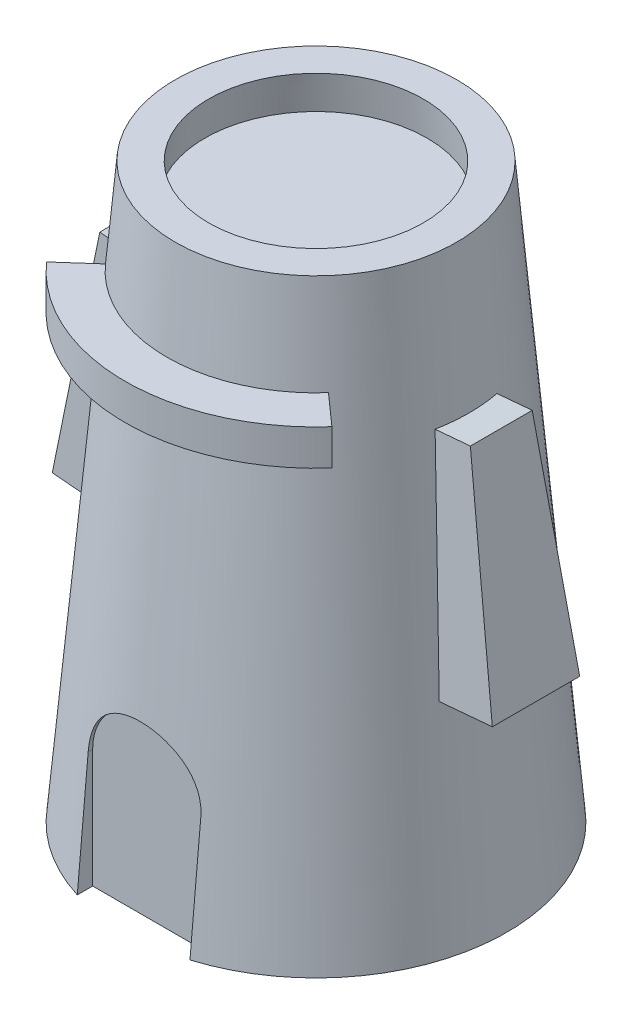
ISO-10303-21;
HEADER;
FILE_DESCRIPTION(('STEP AP214'),'2;1');
FILE_NAME('part.step','',(''),(''),'','','');
FILE_SCHEMA(('AUTOMOTIVE_DESIGN { 1 0 10303 214 1 1 1 1 }'));
ENDSEC;
DATA;
#1=APPLICATION_CONTEXT('core data for automotive mechanical design processes');
#2=APPLICATION_PROTOCOL_DEFINITION('international standard','automotive_design',2000,#1);
#3=PRODUCT_CONTEXT('',#1,'mechanical');
#4=PRODUCT('Part','Part','',(#3));
#5=PRODUCT_RELATED_PRODUCT_CATEGORY('part','',(#4));
#6=PRODUCT_DEFINITION_FORMATION('','',#4);
#7=PRODUCT_DEFINITION_CONTEXT('part definition',#1,'design');
#8=PRODUCT_DEFINITION('design','',#6,#7);
#9=PRODUCT_DEFINITION_SHAPE('','',#8);
#10=(LENGTH_UNIT() NAMED_UNIT(*) SI_UNIT(.MILLI.,.METRE.));
#11=(NAMED_UNIT(*) PLANE_ANGLE_UNIT() SI_UNIT($,.RADIAN.));
#12=(NAMED_UNIT(*) SI_UNIT($,.STERADIAN.) SOLID_ANGLE_UNIT());
#13=UNCERTAINTY_MEASURE_WITH_UNIT(LENGTH_MEASURE(1.E-05),#10,'distance_accuracy_value','');
#14=(GEOMETRIC_REPRESENTATION_CONTEXT(3) GLOBAL_UNCERTAINTY_ASSIGNED_CONTEXT((#13)) GLOBAL_UNIT_ASSIGNED_CONTEXT((#10,
#11,#12)) REPRESENTATION_CONTEXT('',''));
#15=CARTESIAN_POINT('',(0.,0.,0.));
#16=DIRECTION('',(0.,0.,1.));
#17=DIRECTION('',(1.,0.,0.));
#18=AXIS2_PLACEMENT_3D('',#15,#16,#17);
#19=CARTESIAN_POINT('',(11.8429543870565,36.041535535239,2.59239958701239));
#20=DIRECTION('',(-0.00501087536910878,0.0572745675515319,0.998345889479102));
#21=DIRECTION('',(0.,-0.998358423384695,0.0572752866149648));
#22=AXIS2_PLACEMENT_3D('',#19,#20,#21);
#23=PLANE('',#22);
#24=DIRECTION('',(0.996194698091746,0.0871557427476584,0.));
#25=VECTOR('',#24,1.);
#26=CARTESIAN_POINT('',(13.4618295782882,17.5377074278178,3.66207969084797));
#27=LINE('',#26,#25);
#28=CARTESIAN_POINT('',(13.9902531587515,17.5839385006481,3.66207969084797));
#29=VERTEX_POINT('',#28);
#30=CARTESIAN_POINT('',(18.4428030687469,17.9734861415561,3.66207969084797));
#31=VERTEX_POINT('',#30);
#32=EDGE_CURVE('E75',#29,#31,#27,.T.);
#33=ORIENTED_EDGE('',*,*,#32,.T.);
#34=DIRECTION('',(0.156176961155323,-0.986062525051787,0.057353757442587));
#35=VECTOR('',#34,1.);
#36=CARTESIAN_POINT('',(15.5300141692126,36.36411146792,2.59239958701239));
#37=LINE('',#36,#35);
#38=CARTESIAN_POINT('',(15.5300141692126,36.36411146792,2.59239958701239));
#39=VERTEX_POINT('',#38);
#40=EDGE_CURVE('E238',#39,#31,#37,.T.);
#41=ORIENTED_EDGE('',*,*,#40,.F.);
#42=DIRECTION('',(0.996194698091746,0.0871557427476584,0.));
#43=VECTOR('',#42,1.);
#44=CARTESIAN_POINT('',(11.8429543870565,36.041535535239,2.59239958701239));
#45=LINE('',#44,#43);
#46=CARTESIAN_POINT('',(12.5767559659794,36.1057348546721,2.59239958701239));
#47=VERTEX_POINT('',#46);
#48=EDGE_CURVE('E244',#47,#39,#45,.T.);
#49=ORIENTED_EDGE('',*,*,#48,.F.);
#50=CARTESIAN_POINT('',(13.9905140190561,17.5804751477517,3.66227969084797));
#51=CARTESIAN_POINT('',(13.8742056369155,19.1246516323009,3.57310734274572));
#52=CARTESIAN_POINT('',(13.7575556118968,20.6688023983537,3.48393475533349));
#53=CARTESIAN_POINT('',(13.5235134584469,23.757047236142,3.30558910828271));
#54=CARTESIAN_POINT('',(13.4061213302168,25.3011413078928,3.2164160486443));
#55=CARTESIAN_POINT('',(13.170536084674,28.3892684027383,3.03806941138959));
#56=CARTESIAN_POINT('',(13.0523429673271,29.9333014258304,2.94889583377327));
#57=CARTESIAN_POINT('',(12.815085945478,33.0213009514028,2.77054812415699));
#58=CARTESIAN_POINT('',(12.69602204074,34.565267453865,2.68137399215688));
#59=CARTESIAN_POINT('',(12.576487872776,36.1091975747719,2.59219958701239));
#60=B_SPLINE_CURVE_WITH_KNOTS('',3,(#50,#51,#52,#53,#54,#55,#56,#57,#58,#59),.UNSPECIFIED.,.F.,
.F.,(4,2,2,2,4),(0.,4.65334753552028,9.30669381041532,13.9600402851902,18.613388020996),.UNSPECIFIED.);
#61=EDGE_CURVE('E11',#29,#47,#60,.T.);
#62=ORIENTED_EDGE('',*,*,#61,.F.);
#63=EDGE_LOOP('',(#33,#41,#49,#62));
#64=FACE_BOUND('',#63,.T.);
#65=ADVANCED_FACE('F45',(#64),#23,.T.);
#66=CARTESIAN_POINT('',(11.8429543870565,36.041535535239,-2.59239958701239));
#67=DIRECTION('',(-0.0050108753691088,0.0572745675515319,-0.998345889479102));
#68=DIRECTION('',(0.,0.998358423384695,0.0572752866149648));
#69=AXIS2_PLACEMENT_3D('',#66,#67,#68);
#70=PLANE('',#69);
#71=DIRECTION('',(0.996194698091746,0.0871557427476584,0.));
#72=VECTOR('',#71,1.);
#73=CARTESIAN_POINT('',(11.8429543870565,36.041535535239,-2.59239958701239));
#74=LINE('',#73,#72);
#75=CARTESIAN_POINT('',(12.5767559659793,36.1057348546721,-2.59239958701239));
#76=VERTEX_POINT('',#75);
#77=CARTESIAN_POINT('',(15.5300141692126,36.36411146792,-2.59239958701239));
#78=VERTEX_POINT('',#77);
#79=EDGE_CURVE('E249',#76,#78,#74,.T.);
#80=ORIENTED_EDGE('',*,*,#79,.T.);
#81=DIRECTION('',(-0.156176961155323,0.986062525051787,0.057353757442587));
#82=VECTOR('',#81,1.);
#83=CARTESIAN_POINT('',(18.4428030687469,17.9734861415561,-3.66207969084798));
#84=LINE('',#83,#82);
#85=CARTESIAN_POINT('',(18.4428030687469,17.9734861415561,-3.66207969084798));
#86=VERTEX_POINT('',#85);
#87=EDGE_CURVE('E232',#86,#78,#84,.T.);
#88=ORIENTED_EDGE('',*,*,#87,.F.);
#89=DIRECTION('',(0.996194698091746,0.0871557427476584,0.));
#90=VECTOR('',#89,1.);
#91=CARTESIAN_POINT('',(13.4618295782882,17.5377074278178,-3.66207969084798));
#92=LINE('',#91,#90);
#93=CARTESIAN_POINT('',(13.9902531587515,17.5839385006481,-3.66207969084798));
#94=VERTEX_POINT('',#93);
#95=EDGE_CURVE('E253',#94,#86,#92,.T.);
#96=ORIENTED_EDGE('',*,*,#95,.F.);
#97=CARTESIAN_POINT('',(12.576487872776,36.1091975747719,-2.59219958701239));
#98=CARTESIAN_POINT('',(12.69602204074,34.565267453865,-2.68137399215688));
#99=CARTESIAN_POINT('',(12.815085945478,33.0213009514028,-2.77054812415699));
#100=CARTESIAN_POINT('',(13.0523429673271,29.9333014258304,-2.94889583377327));
#101=CARTESIAN_POINT('',(13.170536084674,28.3892684027383,-3.03806941138959));
#102=CARTESIAN_POINT('',(13.4061213302168,25.3011413078928,-3.2164160486443));
#103=CARTESIAN_POINT('',(13.5235134584469,23.757047236142,-3.30558910828271));
#104=CARTESIAN_POINT('',(13.7575556118968,20.6688023983537,-3.48393475533349));
#105=CARTESIAN_POINT('',(13.8742056369155,19.1246516323009,-3.57310734274572));
#106=CARTESIAN_POINT('',(13.9905140190561,17.5804751477517,-3.66227969084797));
#107=B_SPLINE_CURVE_WITH_KNOTS('',3,(#97,#98,#99,#100,#101,#102,#103,#104,#105,#106),
.UNSPECIFIED.,.F.,.F.,(4,2,2,2,4),(0.,4.6533477358058,9.30669421058067,13.9600404854757,
18.613388020996),.UNSPECIFIED.);
#108=EDGE_CURVE('E385',#76,#94,#107,.T.);
#109=ORIENTED_EDGE('',*,*,#108,.F.);
#110=EDGE_LOOP('',(#80,#88,#96,#109));
#111=FACE_BOUND('',#110,.T.);
#112=ADVANCED_FACE('F393',(#111),#70,.T.);
#113=CARTESIAN_POINT('',(11.8429543870565,36.041535535239,2.59239958701239));
#114=DIRECTION('',(-0.0871557427476584,0.996194698091746,0.));
#115=DIRECTION('',(-0.996194698091746,-0.0871557427476584,0.));
#116=AXIS2_PLACEMENT_3D('',#113,#114,#115);
#117=PLANE('',#116);
#118=ORIENTED_EDGE('',*,*,#48,.T.);
#119=DIRECTION('',(0.,0.,1.));
#120=VECTOR('',#119,1.);
#121=CARTESIAN_POINT('',(15.5300141692126,36.36411146792,-2.59239958701239));
#122=LINE('',#121,#120);
#123=EDGE_CURVE('E235',#78,#39,#122,.T.);
#124=ORIENTED_EDGE('',*,*,#123,.F.);
#125=ORIENTED_EDGE('',*,*,#79,.F.);
#126=CARTESIAN_POINT('',(-0.0990322849399,34.9967470814616,0.));
#127=DIRECTION('',(-0.0871557427476584,0.996194698091746,0.));
#128=DIRECTION('',(-0.996194698091746,-0.0871557427476584,0.));
#129=AXIS2_PLACEMENT_3D('',#126,#127,#128);
#130=ELLIPSE('',#129,12.9876031210282,12.9378023547987);
#131=EDGE_CURVE('E60',#47,#76,#130,.T.);
#132=ORIENTED_EDGE('',*,*,#131,.F.);
#133=EDGE_LOOP('',(#118,#124,#125,#132));
#134=FACE_BOUND('',#133,.T.);
#135=ADVANCED_FACE('F397',(#134),#117,.T.);
#136=CARTESIAN_POINT('',(0.,0.,0.));
#137=DIRECTION('',(0.,-1.,0.));
#138=DIRECTION('',(0.,0.,1.));
#139=AXIS2_PLACEMENT_3D('',#136,#137,#138);
#140=CONICAL_SURFACE('',#139,16.,0.0872664625997167);
#141=CARTESIAN_POINT('',(-12.576487872776,36.1091975747719,-2.59219958701239));
#142=CARTESIAN_POINT('',(-12.69602204074,34.565267453865,-2.68137399215688));
#143=CARTESIAN_POINT('',(-12.815085945478,33.0213009514028,-2.77054812415699));
#144=CARTESIAN_POINT('',(-13.0523429673271,29.9333014258304,-2.94889583377327));
#145=CARTESIAN_POINT('',(-13.170536084674,28.3892684027383,-3.03806941138959));
#146=CARTESIAN_POINT('',(-13.4061213302168,25.3011413078928,-3.2164160486443));
#147=CARTESIAN_POINT('',(-13.5235134584469,23.757047236142,-3.30558910828271));
#148=CARTESIAN_POINT('',(-13.7575556118968,20.6688023983537,-3.48393475533349));
#149=CARTESIAN_POINT('',(-13.8742056369155,19.1246516323009,-3.57310734274572));
#150=CARTESIAN_POINT('',(-13.9905140190561,17.5804751477517,-3.66227969084797));
#151=B_SPLINE_CURVE_WITH_KNOTS('',3,(#141,#142,#143,#144,#145,#146,#147,#148,#149,#150),
.UNSPECIFIED.,.F.,.F.,(4,2,2,2,4),(0.,4.6533477358058,9.30669421058067,13.9600404854757,
18.613388020996),.UNSPECIFIED.);
#152=CARTESIAN_POINT('',(-12.5767559659793,36.1057348546721,-2.59239958701239));
#153=VERTEX_POINT('',#152);
#154=CARTESIAN_POINT('',(-13.9902531587515,17.5839385006481,-3.66207969084797));
#155=VERTEX_POINT('',#154);
#156=EDGE_CURVE('E67',#153,#155,#151,.T.);
#157=ORIENTED_EDGE('',*,*,#156,.F.);
#158=CARTESIAN_POINT('',(0.0990322849399,34.9967470814616,0.));
#159=DIRECTION('',(-0.0871557427476584,-0.996194698091746,0.));
#160=DIRECTION('',(0.996194698091746,-0.0871557427476584,0.));
#161=AXIS2_PLACEMENT_3D('',#158,#159,#160);
#162=ELLIPSE('',#161,12.9876031210282,12.9378023547987);
#163=CARTESIAN_POINT('',(-12.5767559659794,36.1057348546721,2.59239958701239));
#164=VERTEX_POINT('',#163);
#165=EDGE_CURVE('E186',#164,#153,#162,.T.);
#166=ORIENTED_EDGE('',*,*,#165,.F.);
#167=CARTESIAN_POINT('',(-13.9905140190561,17.5804751477517,3.66227969084797));
#168=CARTESIAN_POINT('',(-13.8742056369155,19.1246516323009,3.57310734274572));
#169=CARTESIAN_POINT('',(-13.7575556118968,20.6688023983537,3.48393475533349));
#170=CARTESIAN_POINT('',(-13.5235134584469,23.757047236142,3.30558910828271));
#171=CARTESIAN_POINT('',(-13.4061213302168,25.3011413078928,3.2164160486443));
#172=CARTESIAN_POINT('',(-13.170536084674,28.3892684027383,3.03806941138959));
#173=CARTESIAN_POINT('',(-13.0523429673271,29.9333014258304,2.94889583377327));
#174=CARTESIAN_POINT('',(-12.815085945478,33.0213009514028,2.77054812415699));
#175=CARTESIAN_POINT('',(-12.69602204074,34.565267453865,2.68137399215688));
#176=CARTESIAN_POINT('',(-12.576487872776,36.1091975747719,2.59219958701239));
#177=B_SPLINE_CURVE_WITH_KNOTS('',3,(#167,#168,#169,#170,#171,#172,#173,#174,#175,#176),
.UNSPECIFIED.,.F.,.F.,(4,2,2,2,4),(0.,4.65334753552028,9.30669381041532,13.9600402851902,
18.613388020996),.UNSPECIFIED.);
#178=CARTESIAN_POINT('',(-13.9902531587515,17.5839385006481,3.66207969084797));
#179=VERTEX_POINT('',#178);
#180=EDGE_CURVE('E224',#179,#164,#177,.T.);
#181=ORIENTED_EDGE('',*,*,#180,.F.);
#182=CARTESIAN_POINT('',(0.111519164573197,16.3501932867336,0.));
#183=DIRECTION('',(0.0871557427476584,0.996194698091746,0.));
#184=DIRECTION('',(0.996194698091746,-0.0871557427476584,0.));
#185=AXIS2_PLACEMENT_3D('',#182,#183,#184);
#186=ELLIPSE('',#185,14.6251967299783,14.5691166360131);
#187=EDGE_CURVE('E192',#155,#179,#186,.T.);
#188=ORIENTED_EDGE('',*,*,#187,.F.);
#189=EDGE_LOOP('',(#157,#166,#181,#188));
#190=FACE_BOUND('',#189,.T.);
#191=CARTESIAN_POINT('',(-0.111519164573197,16.3501932867336,0.));
#192=DIRECTION('',(0.0871557427476584,-0.996194698091746,0.));
#193=DIRECTION('',(-0.996194698091746,-0.0871557427476584,0.));
#194=AXIS2_PLACEMENT_3D('',#191,#192,#193);
#195=ELLIPSE('',#194,14.6251967299783,14.5691166360131);
#196=EDGE_CURVE('E381',#94,#29,#195,.T.);
#197=ORIENTED_EDGE('',*,*,#196,.T.);
#198=ORIENTED_EDGE('',*,*,#61,.T.);
#199=ORIENTED_EDGE('',*,*,#131,.T.);
#200=ORIENTED_EDGE('',*,*,#108,.T.);
#201=EDGE_LOOP('',(#197,#198,#199,#200));
#202=FACE_BOUND('',#201,.T.);
#203=CARTESIAN_POINT('',(0.,37.,0.));
#204=DIRECTION('',(0.,1.,0.));
#205=DIRECTION('',(0.,0.,1.));
#206=AXIS2_PLACEMENT_3D('',#203,#204,#205);
#207=CIRCLE('',#206,12.7629194495408);
#208=CARTESIAN_POINT('',(-9.54144119850317,37.,8.47661564133785));
#209=VERTEX_POINT('',#208);
#210=CARTESIAN_POINT('',(9.54144119850317,37.,8.47661564133785));
#211=VERTEX_POINT('',#210);
#212=EDGE_CURVE('E374',#209,#211,#207,.T.);
#213=ORIENTED_EDGE('',*,*,#212,.F.);
#214=DIRECTION('',(0.0651568316972,0.996194698091746,-0.0578853243670514));
#215=VECTOR('',#214,1.);
#216=CARTESIAN_POINT('',(0.,182.880836844181,0.));
#217=LINE('',#216,#215);
#218=CARTESIAN_POINT('',(-9.3452240378758,40.,8.30229633063101));
#219=VERTEX_POINT('',#218);
#220=EDGE_CURVE('E377',#209,#219,#217,.T.);
#221=ORIENTED_EDGE('',*,*,#220,.T.);
#222=CARTESIAN_POINT('',(0.,40.,0.));
#223=DIRECTION('',(0.,-1.,0.));
#224=DIRECTION('',(0.,0.,1.));
#225=AXIS2_PLACEMENT_3D('',#222,#223,#224);
#226=CIRCLE('',#225,12.500453458963);
#227=CARTESIAN_POINT('',(9.3452240378758,40.,8.30229633063101));
#228=VERTEX_POINT('',#227);
#229=EDGE_CURVE('E278',#228,#219,#226,.T.);
#230=ORIENTED_EDGE('',*,*,#229,.F.);
#231=DIRECTION('',(0.0651568316971999,-0.996194698091745,0.0578853243670515));
#232=VECTOR('',#231,1.);
#233=CARTESIAN_POINT('',(0.,182.880836844181,0.));
#234=LINE('',#233,#232);
#235=EDGE_CURVE('E368',#228,#211,#234,.T.);
#236=ORIENTED_EDGE('',*,*,#235,.T.);
#237=EDGE_LOOP('',(#213,#221,#230,#236));
#238=FACE_BOUND('',#237,.T.);
#239=CARTESIAN_POINT('',(0.,48.,0.));
#240=DIRECTION('',(0.,1.,0.));
#241=DIRECTION('',(0.,0.,1.));
#242=AXIS2_PLACEMENT_3D('',#239,#240,#241);
#243=CIRCLE('',#242,11.8005441507556);
#244=CARTESIAN_POINT('',(0.,48.,11.8005441507556));
#245=VERTEX_POINT('',#244);
#246=EDGE_CURVE('E369',#245,#245,#243,.T.);
#247=ORIENTED_EDGE('',*,*,#246,.F.);
#248=EDGE_LOOP('',(#247));
#249=FACE_BOUND('',#248,.T.);
#250=CARTESIAN_POINT('',(-4.72137497250259,9.93191785659461,14.3756005464363));
#251=CARTESIAN_POINT('',(-4.72139788835783,10.0590150872273,14.3638758051247));
#252=CARTESIAN_POINT('',(-4.71625427873994,10.1862710893364,14.3538579667337));
#253=CARTESIAN_POINT('',(-4.69568402436785,10.4401614953945,14.3372358710072));
#254=CARTESIAN_POINT('',(-4.68025833059139,10.5667959557383,14.3306312980833));
#255=CARTESIAN_POINT('',(-4.63921932100184,10.8182497434939,14.3208441702329));
#256=CARTESIAN_POINT('',(-4.61362860166552,10.9430724646487,14.3176540827566));
#257=CARTESIAN_POINT('',(-4.55243134515556,11.1902757920821,14.3145369678067));
#258=CARTESIAN_POINT('',(-4.51682495561441,11.3126564343289,14.3146098922384));
#259=CARTESIAN_POINT('',(-4.43584755746242,11.5541084723224,14.317796453754));
#260=CARTESIAN_POINT('',(-4.39047600691323,11.673179683991,14.3209102596321));
#261=CARTESIAN_POINT('',(-4.29028718329289,11.907220331802,14.329870893753));
#262=CARTESIAN_POINT('',(-4.23546637777038,12.0221882145099,14.3357187454798));
#263=CARTESIAN_POINT('',(-4.11679138643067,12.2471941395018,14.3497696153254));
#264=CARTESIAN_POINT('',(-4.05293872141406,12.3572330076432,14.3579722371826));
#265=CARTESIAN_POINT('',(-3.91664744833961,12.5717063480938,14.3763014076876));
#266=CARTESIAN_POINT('',(-3.84420558044353,12.6761386705787,14.3864286876807));
#267=CARTESIAN_POINT('',(-3.61203033561829,12.9835416259394,14.4193855178464));
#268=CARTESIAN_POINT('',(-3.43945884255084,13.176803447879,14.4445255741758));
#269=CARTESIAN_POINT('',(-3.0653099344814,13.5323946398322,14.4967297965062));
#270=CARTESIAN_POINT('',(-2.86372441952788,13.6947153423873,14.5237944987466));
#271=CARTESIAN_POINT('',(-2.42977315730511,13.9890134769174,14.5766569022345));
#272=CARTESIAN_POINT('',(-2.19663639456861,14.1198707500282,14.6023875973823));
#273=CARTESIAN_POINT('',(-1.71116345935544,14.3405633663105,14.6477619018518));
#274=CARTESIAN_POINT('',(-1.45883003561549,14.4304045696527,14.6674063806127));
#275=CARTESIAN_POINT('',(-0.944326325035236,14.5656640291313,14.6975964542417));
#276=CARTESIAN_POINT('',(-0.682260423170302,14.6114610762363,14.7082195409522));
#277=CARTESIAN_POINT('',(-0.153956869099089,14.6584254559354,14.7191184843299));
#278=CARTESIAN_POINT('',(0.112280275684338,14.6595981754557,14.7193955899355));
#279=CARTESIAN_POINT('',(0.635021993287651,14.6177719919119,14.7096802602249));
#280=CARTESIAN_POINT('',(0.891610941764581,14.5757628831868,14.6999179417548));
#281=CARTESIAN_POINT('',(1.39399656187394,14.4504335930244,14.6718241006602));
#282=CARTESIAN_POINT('',(1.63979277381855,14.3671116538316,14.6534922134243));
#283=CARTESIAN_POINT('',(2.11564371527183,14.1609700592217,14.6106424372933));
#284=CARTESIAN_POINT('',(2.34557560942395,14.0378768022659,14.586081958983));
#285=CARTESIAN_POINT('',(2.78200344961043,13.7556375445066,14.5343091977987));
#286=CARTESIAN_POINT('',(2.98849490758702,13.5964846569101,14.5070964089437));
#287=CARTESIAN_POINT('',(3.27874896293216,13.3319633687636,14.4670481199013));
#288=CARTESIAN_POINT('',(3.37326355787484,13.2382043026011,14.4536716514318));
#289=CARTESIAN_POINT('',(3.55409177401787,13.042983553911,14.427861758656));
#290=CARTESIAN_POINT('',(3.64040841532043,12.9415247329262,14.4154279874058));
#291=CARTESIAN_POINT('',(3.80426951625068,12.7315230094764,14.3920588502497));
#292=CARTESIAN_POINT('',(3.88180981062927,12.6229767815481,14.3811241953077));
#293=CARTESIAN_POINT('',(4.0274770785046,12.3996218110075,14.3613070282121));
#294=CARTESIAN_POINT('',(4.0956079126914,12.2848156639624,14.3524236734013));
#295=CARTESIAN_POINT('',(4.22153854623757,12.0505051825112,14.3372582831934));
#296=CARTESIAN_POINT('',(4.27940491493546,11.931037751277,14.330959109704));
#297=CARTESIAN_POINT('',(4.38488884071248,11.6876007644461,14.3213118421639));
#298=CARTESIAN_POINT('',(4.43251064532901,11.5636330997217,14.3179625232736));
#299=CARTESIAN_POINT('',(4.51712081282112,11.312184167939,14.3145647465853));
#300=CARTESIAN_POINT('',(4.55411756754405,11.1847057614257,14.314513676596));
#301=CARTESIAN_POINT('',(4.61722858120083,10.9271812827916,14.3179561466824));
#302=CARTESIAN_POINT('',(4.64334733622303,10.7971362948134,14.3214482202534));
#303=CARTESIAN_POINT('',(4.68309663257963,10.5446164119529,14.3317436087191));
#304=CARTESIAN_POINT('',(4.69747269290635,10.4222480201326,14.3382983155178));
#305=CARTESIAN_POINT('',(4.71661371475432,10.1771772705615,14.3545775346267));
#306=CARTESIAN_POINT('',(4.72139462459299,10.0544758069876,14.3642967558148));
#307=CARTESIAN_POINT('',(4.72137497250259,9.93191785659461,14.3756005464363));
#308=B_SPLINE_CURVE_WITH_KNOTS('',3,(#250,#251,#252,#253,#254,#255,#256,#257,#258,#259,#260,
#261,#262,#263,#264,#265,#266,#267,#268,#269,#270,#271,#272,#273,#274,#275,#276,#277,#278,#279,
#280,#281,#282,#283,#284,#285,#286,#287,#288,#289,#290,#291,#292,#293,#294,#295,#296,#297,#298,
#299,#300,#301,#302,#303,#304,#305,#306,#307),.UNSPECIFIED.,.F.,.F.,(4,2,2,2,2,2,2,2,2,2,2,2,2,
2,2,2,2,2,2,2,2,2,2,2,2,2,2,2,4),(0.,0.382797036526025,0.765558673520905,1.14747416502821,
1.52938402733779,1.91131509001384,2.29338924234638,2.67539913676789,3.05755448133077,
3.83467280582132,4.61200850363488,5.41389316221393,6.21566321564603,7.01047449163439,
7.80518981988569,8.58208662110998,9.35901648014699,10.1414091785669,10.9239514271924,
11.3249611626804,11.7258225896185,12.126873474404,12.5277593165161,12.9259417747002,
13.3239588213995,13.7216606373559,14.119197911913,14.4889379122243,14.8580628486362),.UNSPECIFIED.);
#309=CARTESIAN_POINT('',(-4.72137497673865,9.93211785659461,14.3755821277671));
#310=VERTEX_POINT('',#309);
#311=CARTESIAN_POINT('',(4.72137497673865,9.93211785659462,14.3755821277671));
#312=VERTEX_POINT('',#311);
#313=EDGE_CURVE('E359',#310,#312,#308,.T.);
#314=ORIENTED_EDGE('',*,*,#313,.T.);
#315=CARTESIAN_POINT('',(4.72137497673865,20.0638017122441,13.4394391211516));
#316=CARTESIAN_POINT('',(4.72137497673865,15.7148954767797,13.8426666135956));
#317=CARTESIAN_POINT('',(4.72137497673865,11.3658154713658,14.2440142550417));
#318=CARTESIAN_POINT('',(4.72137497673865,2.66737341078984,15.0436308338049));
#319=CARTESIAN_POINT('',(4.72137497673865,-1.6819886443048,15.4418997718559));
#320=CARTESIAN_POINT('',(4.72137497673865,-7.39819083521981,15.9637409895659));
#321=CARTESIAN_POINT('',(4.72137497673865,-8.76493244842721,16.0883936612874));
#322=CARTESIAN_POINT('',(4.72137497673865,-10.1316838556495,16.2129385338625));
#323=B_SPLINE_CURVE_WITH_KNOTS('',3,(#315,#316,#317,#318,#319,#320,#321,#322),.UNSPECIFIED.,.F.,
.F.,(4,2,2,4),(0.,13.1026779953092,26.2053528671949,30.322595638231),.UNSPECIFIED.);
#324=CARTESIAN_POINT('',(4.72137497673865,0.,15.2875314661663));
#325=VERTEX_POINT('',#324);
#326=EDGE_CURVE('E335',#312,#325,#323,.T.);
#327=ORIENTED_EDGE('',*,*,#326,.T.);
#328=CARTESIAN_POINT('',(0.,0.,0.));
#329=DIRECTION('',(0.,1.,0.));
#330=DIRECTION('',(0.,0.,1.));
#331=AXIS2_PLACEMENT_3D('',#328,#329,#330);
#332=CIRCLE('',#331,16.);
#333=CARTESIAN_POINT('',(-4.72137497673865,0.,15.2875314661663));
#334=VERTEX_POINT('',#333);
#335=EDGE_CURVE('E459',#325,#334,#332,.T.);
#336=ORIENTED_EDGE('',*,*,#335,.T.);
#337=CARTESIAN_POINT('',(-4.72137497673865,-10.1316838556495,16.2129385338625));
#338=CARTESIAN_POINT('',(-4.72137497673865,-7.61522695712537,15.9836285112462));
#339=CARTESIAN_POINT('',(-4.72137497673865,-5.09880379887518,15.7539477970251));
#340=CARTESIAN_POINT('',(-4.72137497673865,-0.0660366125740351,15.2937254544311));
#341=CARTESIAN_POINT('',(-4.72137497673865,2.45030741548923,15.0631838261929));
#342=CARTESIAN_POINT('',(-4.72137497673865,7.48290557305144,14.6011200443265));
#343=CARTESIAN_POINT('',(-4.72137497673865,9.99915970254703,14.3695978906617));
#344=CARTESIAN_POINT('',(-4.72137497673865,15.0315631839285,13.9054134710712));
#345=CARTESIAN_POINT('',(-4.72137497673865,17.5477125357978,13.6727512049669));
#346=CARTESIAN_POINT('',(-4.72137497673865,20.0638017122441,13.4394391211516));
#347=B_SPLINE_CURVE_WITH_KNOTS('',3,(#337,#338,#339,#340,#341,#342,#343,#344,#345,#346),
.UNSPECIFIED.,.F.,.F.,(4,2,2,2,4),(0.,7.58064945053332,15.1612977154162,22.7419462638079,
30.3225959996163),.UNSPECIFIED.);
#348=EDGE_CURVE('E316',#334,#310,#347,.T.);
#349=ORIENTED_EDGE('',*,*,#348,.T.);
#350=EDGE_LOOP('',(#314,#327,#336,#349));
#351=FACE_BOUND('',#350,.T.);
#352=ADVANCED_FACE('F47',(#190,#202,#238,#249,#351),#140,.T.);
#353=CARTESIAN_POINT('',(0.,48.,0.));
#354=DIRECTION('',(0.,1.,0.));
#355=DIRECTION('',(0.,0.,1.));
#356=AXIS2_PLACEMENT_3D('',#353,#354,#355);
#357=PLANE('',#356);
#358=CARTESIAN_POINT('',(0.,48.,0.));
#359=DIRECTION('',(0.,1.,0.));
#360=DIRECTION('',(0.,0.,1.));
#361=AXIS2_PLACEMENT_3D('',#358,#359,#360);
#362=CIRCLE('',#361,9.);
#363=CARTESIAN_POINT('',(0.,48.,9.));
#364=VERTEX_POINT('',#363);
#365=EDGE_CURVE('E451',#364,#364,#362,.T.);
#366=ORIENTED_EDGE('',*,*,#365,.F.);
#367=EDGE_LOOP('',(#366));
#368=FACE_BOUND('',#367,.T.);
#369=ORIENTED_EDGE('',*,*,#246,.T.);
#370=EDGE_LOOP('',(#369));
#371=FACE_BOUND('',#370,.T.);
#372=ADVANCED_FACE('F466',(#368,#371),#357,.T.);
#373=CARTESIAN_POINT('',(0.,0.,0.));
#374=DIRECTION('',(0.,1.,0.));
#375=DIRECTION('',(0.,0.,1.));
#376=AXIS2_PLACEMENT_3D('',#373,#374,#375);
#377=PLANE('',#376);
#378=CARTESIAN_POINT('',(0.,0.,0.));
#379=DIRECTION('',(0.,1.,0.));
#380=DIRECTION('',(0.,0.,1.));
#381=AXIS2_PLACEMENT_3D('',#378,#379,#380);
#382=CIRCLE('',#381,12.5);
#383=CARTESIAN_POINT('',(0.,0.,12.5));
#384=VERTEX_POINT('',#383);
#385=EDGE_CURVE('E287',#384,#384,#382,.T.);
#386=ORIENTED_EDGE('',*,*,#385,.T.);
#387=EDGE_LOOP('',(#386));
#388=FACE_BOUND('',#387,.T.);
#389=ORIENTED_EDGE('',*,*,#335,.F.);
#390=DIRECTION('',(0.,0.,1.));
#391=VECTOR('',#390,1.);
#392=CARTESIAN_POINT('',(4.72137497673865,0.,14.));
#393=LINE('',#392,#391);
#394=CARTESIAN_POINT('',(4.72137497673865,0.,14.));
#395=VERTEX_POINT('',#394);
#396=EDGE_CURVE('E317',#395,#325,#393,.T.);
#397=ORIENTED_EDGE('',*,*,#396,.F.);
#398=DIRECTION('',(1.,0.,0.));
#399=VECTOR('',#398,1.);
#400=CARTESIAN_POINT('',(-4.72137497673865,0.,14.));
#401=LINE('',#400,#399);
#402=CARTESIAN_POINT('',(-4.72137497673865,0.,14.));
#403=VERTEX_POINT('',#402);
#404=EDGE_CURVE('E304',#403,#395,#401,.T.);
#405=ORIENTED_EDGE('',*,*,#404,.F.);
#406=DIRECTION('',(0.,0.,1.));
#407=VECTOR('',#406,1.);
#408=CARTESIAN_POINT('',(-4.72137497673865,0.,14.));
#409=LINE('',#408,#407);
#410=EDGE_CURVE('E320',#403,#334,#409,.T.);
#411=ORIENTED_EDGE('',*,*,#410,.T.);
#412=EDGE_LOOP('',(#389,#397,#405,#411));
#413=FACE_BOUND('',#412,.T.);
#414=ADVANCED_FACE('F446',(#388,#413),#377,.F.);
#415=CARTESIAN_POINT('',(0.,48.,0.));
#416=DIRECTION('',(0.,-1.,0.));
#417=DIRECTION('',(0.,0.,1.));
#418=AXIS2_PLACEMENT_3D('',#415,#416,#417);
#419=CONICAL_SURFACE('',#418,9.,0.10471975511966);
#420=CARTESIAN_POINT('',(0.,45.,0.));
#421=DIRECTION('',(0.,1.,0.));
#422=DIRECTION('',(0.,0.,1.));
#423=AXIS2_PLACEMENT_3D('',#420,#421,#422);
#424=CIRCLE('',#423,9.31531270579703);
#425=CARTESIAN_POINT('',(0.,45.,9.31531270579703));
#426=VERTEX_POINT('',#425);
#427=EDGE_CURVE('E454',#426,#426,#424,.T.);
#428=ORIENTED_EDGE('',*,*,#427,.F.);
#429=EDGE_LOOP('',(#428));
#430=FACE_BOUND('',#429,.T.);
#431=ORIENTED_EDGE('',*,*,#365,.T.);
#432=EDGE_LOOP('',(#431));
#433=FACE_BOUND('',#432,.T.);
#434=ADVANCED_FACE('F542',(#430,#433),#419,.F.);
#435=CARTESIAN_POINT('',(0.,45.,0.));
#436=DIRECTION('',(0.,1.,0.));
#437=DIRECTION('',(0.,0.,1.));
#438=AXIS2_PLACEMENT_3D('',#435,#436,#437);
#439=PLANE('',#438);
#440=ORIENTED_EDGE('',*,*,#427,.T.);
#441=EDGE_LOOP('',(#440));
#442=FACE_BOUND('',#441,.T.);
#443=ADVANCED_FACE('F355',(#442),#439,.T.);
#444=CARTESIAN_POINT('',(0.,9.93211785659462,14.));
#445=DIRECTION('',(0.,0.,1.));
#446=DIRECTION('',(1.,0.,0.));
#447=AXIS2_PLACEMENT_3D('',#444,#445,#446);
#448=CYLINDRICAL_SURFACE('',#447,4.72137497673865);
#449=DIRECTION('',(0.,0.,1.));
#450=VECTOR('',#449,1.);
#451=CARTESIAN_POINT('',(-4.72137497673865,9.93211785659461,14.));
#452=LINE('',#451,#450);
#453=CARTESIAN_POINT('',(-4.72137497673865,9.93211785659461,14.));
#454=VERTEX_POINT('',#453);
#455=EDGE_CURVE('E311',#454,#310,#452,.T.);
#456=ORIENTED_EDGE('',*,*,#455,.F.);
#457=CARTESIAN_POINT('',(0.,9.93211785659462,14.));
#458=DIRECTION('',(0.,0.,1.));
#459=DIRECTION('',(1.,0.,0.));
#460=AXIS2_PLACEMENT_3D('',#457,#458,#459);
#461=CIRCLE('',#460,4.72137497673865);
#462=CARTESIAN_POINT('',(4.72137497673865,9.93211785659462,14.));
#463=VERTEX_POINT('',#462);
#464=EDGE_CURVE('E297',#463,#454,#461,.T.);
#465=ORIENTED_EDGE('',*,*,#464,.F.);
#466=DIRECTION('',(0.,0.,1.));
#467=VECTOR('',#466,1.);
#468=CARTESIAN_POINT('',(4.72137497673865,9.93211785659462,14.));
#469=LINE('',#468,#467);
#470=EDGE_CURVE('E312',#463,#312,#469,.T.);
#471=ORIENTED_EDGE('',*,*,#470,.T.);
#472=ORIENTED_EDGE('',*,*,#313,.F.);
#473=EDGE_LOOP('',(#456,#465,#471,#472));
#474=FACE_BOUND('',#473,.T.);
#475=ADVANCED_FACE('F351',(#474),#448,.F.);
#476=CARTESIAN_POINT('',(4.72137497673865,0.,14.));
#477=DIRECTION('',(1.,0.,0.));
#478=DIRECTION('',(0.,0.,-1.));
#479=AXIS2_PLACEMENT_3D('',#476,#477,#478);
#480=PLANE('',#479);
#481=ORIENTED_EDGE('',*,*,#470,.F.);
#482=DIRECTION('',(0.,1.,0.));
#483=VECTOR('',#482,1.);
#484=CARTESIAN_POINT('',(4.72137497673865,0.,14.));
#485=LINE('',#484,#483);
#486=EDGE_CURVE('E307',#395,#463,#485,.T.);
#487=ORIENTED_EDGE('',*,*,#486,.F.);
#488=ORIENTED_EDGE('',*,*,#396,.T.);
#489=ORIENTED_EDGE('',*,*,#326,.F.);
#490=EDGE_LOOP('',(#481,#487,#488,#489));
#491=FACE_BOUND('',#490,.T.);
#492=ADVANCED_FACE('F347',(#491),#480,.F.);
#493=CARTESIAN_POINT('',(-4.72137497673865,0.,14.));
#494=DIRECTION('',(-1.,0.,0.));
#495=DIRECTION('',(0.,0.,1.));
#496=AXIS2_PLACEMENT_3D('',#493,#494,#495);
#497=PLANE('',#496);
#498=ORIENTED_EDGE('',*,*,#410,.F.);
#499=DIRECTION('',(0.,-1.,0.));
#500=VECTOR('',#499,1.);
#501=CARTESIAN_POINT('',(-4.72137497673865,0.,14.));
#502=LINE('',#501,#500);
#503=EDGE_CURVE('E301',#454,#403,#502,.T.);
#504=ORIENTED_EDGE('',*,*,#503,.F.);
#505=ORIENTED_EDGE('',*,*,#455,.T.);
#506=ORIENTED_EDGE('',*,*,#348,.F.);
#507=EDGE_LOOP('',(#498,#504,#505,#506));
#508=FACE_BOUND('',#507,.T.);
#509=ADVANCED_FACE('F342',(#508),#497,.F.);
#510=CARTESIAN_POINT('',(0.,9.93211785659462,14.));
#511=DIRECTION('',(0.,0.,1.));
#512=DIRECTION('',(1.,0.,0.));
#513=AXIS2_PLACEMENT_3D('',#510,#511,#512);
#514=PLANE('',#513);
#515=ORIENTED_EDGE('',*,*,#464,.T.);
#516=ORIENTED_EDGE('',*,*,#503,.T.);
#517=ORIENTED_EDGE('',*,*,#404,.T.);
#518=ORIENTED_EDGE('',*,*,#486,.T.);
#519=EDGE_LOOP('',(#515,#516,#517,#518));
#520=FACE_BOUND('',#519,.T.);
#521=ADVANCED_FACE('F346',(#520),#514,.T.);
#522=CARTESIAN_POINT('',(0.,0.,0.));
#523=DIRECTION('',(0.,-1.,0.));
#524=DIRECTION('',(0.,0.,1.));
#525=AXIS2_PLACEMENT_3D('',#522,#523,#524);
#526=CONICAL_SURFACE('',#525,12.5,0.0872664625997167);
#527=CARTESIAN_POINT('',(0.,43.,0.));
#528=DIRECTION('',(0.,1.,0.));
#529=DIRECTION('',(0.,0.,1.));
#530=AXIS2_PLACEMENT_3D('',#527,#528,#529);
#531=CIRCLE('',#530,8.73798746838526);
#532=CARTESIAN_POINT('',(0.,43.,8.73798746838527));
#533=VERTEX_POINT('',#532);
#534=EDGE_CURVE('E293',#533,#533,#531,.T.);
#535=ORIENTED_EDGE('',*,*,#534,.T.);
#536=EDGE_LOOP('',(#535));
#537=FACE_BOUND('',#536,.T.);
#538=ORIENTED_EDGE('',*,*,#385,.F.);
#539=EDGE_LOOP('',(#538));
#540=FACE_BOUND('',#539,.T.);
#541=ADVANCED_FACE('F428',(#537,#540),#526,.F.);
#542=CARTESIAN_POINT('',(0.,43.,0.));
#543=DIRECTION('',(0.,1.,0.));
#544=DIRECTION('',(0.,0.,1.));
#545=AXIS2_PLACEMENT_3D('',#542,#543,#544);
#546=PLANE('',#545);
#547=ORIENTED_EDGE('',*,*,#534,.F.);
#548=EDGE_LOOP('',(#547));
#549=FACE_BOUND('',#548,.T.);
#550=ADVANCED_FACE('F418',(#549),#546,.F.);
#551=CARTESIAN_POINT('',(-11.9614528462407,37.,10.6265538067221));
#552=DIRECTION('',(-0.664159612920132,0.,-0.747590802890044));
#553=DIRECTION('',(-0.747590802890044,0.,0.664159612920132));
#554=AXIS2_PLACEMENT_3D('',#551,#552,#553);
#555=PLANE('',#554);
#556=ORIENTED_EDGE('',*,*,#220,.F.);
#557=DIRECTION('',(-0.747590802890044,0.,0.664159612920132));
#558=VECTOR('',#557,1.);
#559=CARTESIAN_POINT('',(-11.9614528462407,37.,10.6265538067221));
#560=LINE('',#559,#558);
#561=CARTESIAN_POINT('',(-11.9614528462407,37.,10.6265538067221));
#562=VERTEX_POINT('',#561);
#563=EDGE_CURVE('E268',#209,#562,#560,.T.);
#564=ORIENTED_EDGE('',*,*,#563,.T.);
#565=DIRECTION('',(0.,1.,0.));
#566=VECTOR('',#565,1.);
#567=CARTESIAN_POINT('',(-11.9614528462407,37.,10.6265538067221));
#568=LINE('',#567,#566);
#569=CARTESIAN_POINT('',(-11.9614528462407,40.,10.6265538067221));
#570=VERTEX_POINT('',#569);
#571=EDGE_CURVE('E284',#562,#570,#568,.T.);
#572=ORIENTED_EDGE('',*,*,#571,.T.);
#573=DIRECTION('',(-0.747590802890044,0.,0.664159612920132));
#574=VECTOR('',#573,1.);
#575=CARTESIAN_POINT('',(-11.9614528462407,40.,10.6265538067221));
#576=LINE('',#575,#574);
#577=EDGE_CURVE('E264',#219,#570,#576,.T.);
#578=ORIENTED_EDGE('',*,*,#577,.F.);
#579=EDGE_LOOP('',(#556,#564,#572,#578));
#580=FACE_BOUND('',#579,.T.);
#581=ADVANCED_FACE('F414',(#580),#555,.T.);
#582=CARTESIAN_POINT('',(11.9614528462407,37.,10.6265538067221));
#583=DIRECTION('',(0.664159612920133,0.,-0.747590802890043));
#584=DIRECTION('',(-0.747590802890043,0.,-0.664159612920133));
#585=AXIS2_PLACEMENT_3D('',#582,#583,#584);
#586=PLANE('',#585);
#587=ORIENTED_EDGE('',*,*,#235,.F.);
#588=DIRECTION('',(-0.747590802890043,0.,-0.664159612920133));
#589=VECTOR('',#588,1.);
#590=CARTESIAN_POINT('',(11.9614528462407,40.,10.6265538067221));
#591=LINE('',#590,#589);
#592=CARTESIAN_POINT('',(11.9614528462407,40.,10.6265538067221));
#593=VERTEX_POINT('',#592);
#594=EDGE_CURVE('E275',#593,#228,#591,.T.);
#595=ORIENTED_EDGE('',*,*,#594,.F.);
#596=DIRECTION('',(0.,1.,0.));
#597=VECTOR('',#596,1.);
#598=CARTESIAN_POINT('',(11.9614528462407,37.,10.6265538067221));
#599=LINE('',#598,#597);
#600=CARTESIAN_POINT('',(11.9614528462407,37.,10.6265538067221));
#601=VERTEX_POINT('',#600);
#602=EDGE_CURVE('E271',#601,#593,#599,.T.);
#603=ORIENTED_EDGE('',*,*,#602,.F.);
#604=DIRECTION('',(-0.747590802890043,0.,-0.664159612920133));
#605=VECTOR('',#604,1.);
#606=CARTESIAN_POINT('',(11.9614528462407,37.,10.6265538067221));
#607=LINE('',#606,#605);
#608=EDGE_CURVE('E263',#601,#211,#607,.T.);
#609=ORIENTED_EDGE('',*,*,#608,.T.);
#610=EDGE_LOOP('',(#587,#595,#603,#609));
#611=FACE_BOUND('',#610,.T.);
#612=ADVANCED_FACE('F417',(#611),#586,.T.);
#613=CARTESIAN_POINT('',(0.,37.,0.));
#614=DIRECTION('',(0.,1.,0.));
#615=DIRECTION('',(0.,0.,1.));
#616=AXIS2_PLACEMENT_3D('',#613,#614,#615);
#617=CYLINDRICAL_SURFACE('',#616,16.);
#618=CARTESIAN_POINT('',(0.,40.,0.));
#619=DIRECTION('',(0.,1.,0.));
#620=DIRECTION('',(0.,0.,1.));
#621=AXIS2_PLACEMENT_3D('',#618,#619,#620);
#622=CIRCLE('',#621,16.);
#623=EDGE_CURVE('E248',#570,#593,#622,.T.);
#624=ORIENTED_EDGE('',*,*,#623,.F.);
#625=ORIENTED_EDGE('',*,*,#571,.F.);
#626=CARTESIAN_POINT('',(0.,37.,0.));
#627=DIRECTION('',(0.,1.,0.));
#628=DIRECTION('',(0.,0.,1.));
#629=AXIS2_PLACEMENT_3D('',#626,#627,#628);
#630=CIRCLE('',#629,16.);
#631=EDGE_CURVE('E259',#562,#601,#630,.T.);
#632=ORIENTED_EDGE('',*,*,#631,.T.);
#633=ORIENTED_EDGE('',*,*,#602,.T.);
#634=EDGE_LOOP('',(#624,#625,#632,#633));
#635=FACE_BOUND('',#634,.T.);
#636=ADVANCED_FACE('F409',(#635),#617,.T.);
#637=CARTESIAN_POINT('',(0.,37.,0.));
#638=DIRECTION('',(0.,1.,0.));
#639=DIRECTION('',(0.,0.,1.));
#640=AXIS2_PLACEMENT_3D('',#637,#638,#639);
#641=PLANE('',#640);
#642=ORIENTED_EDGE('',*,*,#563,.F.);
#643=ORIENTED_EDGE('',*,*,#212,.T.);
#644=ORIENTED_EDGE('',*,*,#608,.F.);
#645=ORIENTED_EDGE('',*,*,#631,.F.);
#646=EDGE_LOOP('',(#642,#643,#644,#645));
#647=FACE_BOUND('',#646,.T.);
#648=ADVANCED_FACE('F406',(#647),#641,.F.);
#649=CARTESIAN_POINT('',(0.,40.,0.));
#650=DIRECTION('',(0.,1.,0.));
#651=DIRECTION('',(0.,0.,1.));
#652=AXIS2_PLACEMENT_3D('',#649,#650,#651);
#653=PLANE('',#652);
#654=ORIENTED_EDGE('',*,*,#623,.T.);
#655=ORIENTED_EDGE('',*,*,#594,.T.);
#656=ORIENTED_EDGE('',*,*,#229,.T.);
#657=ORIENTED_EDGE('',*,*,#577,.T.);
#658=EDGE_LOOP('',(#654,#655,#656,#657));
#659=FACE_BOUND('',#658,.T.);
#660=ADVANCED_FACE('F401',(#659),#653,.T.);
#661=CARTESIAN_POINT('',(13.4618295782882,17.5377074278178,3.66207969084797));
#662=DIRECTION('',(0.0871557427476584,-0.996194698091746,0.));
#663=DIRECTION('',(0.996194698091746,0.0871557427476584,0.));
#664=AXIS2_PLACEMENT_3D('',#661,#662,#663);
#665=PLANE('',#664);
#666=ORIENTED_EDGE('',*,*,#196,.F.);
#667=ORIENTED_EDGE('',*,*,#95,.T.);
#668=DIRECTION('',(0.,0.,-1.));
#669=VECTOR('',#668,1.);
#670=CARTESIAN_POINT('',(18.4428030687469,17.9734861415561,3.66207969084797));
#671=LINE('',#670,#669);
#672=EDGE_CURVE('E241',#31,#86,#671,.T.);
#673=ORIENTED_EDGE('',*,*,#672,.F.);
#674=ORIENTED_EDGE('',*,*,#32,.F.);
#675=EDGE_LOOP('',(#666,#667,#673,#674));
#676=FACE_BOUND('',#675,.T.);
#677=ADVANCED_FACE('F399',(#676),#665,.T.);
#678=CARTESIAN_POINT('',(20.7685318859652,3.28941229912081,0.));
#679=DIRECTION('',(0.987688340595138,0.156434465040228,0.));
#680=DIRECTION('',(-0.156434465040228,0.987688340595138,0.));
#681=AXIS2_PLACEMENT_3D('',#678,#679,#680);
#682=PLANE('',#681);
#683=ORIENTED_EDGE('',*,*,#87,.T.);
#684=ORIENTED_EDGE('',*,*,#123,.T.);
#685=ORIENTED_EDGE('',*,*,#40,.T.);
#686=ORIENTED_EDGE('',*,*,#672,.T.);
#687=EDGE_LOOP('',(#683,#684,#685,#686));
#688=FACE_BOUND('',#687,.T.);
#689=ADVANCED_FACE('F221',(#688),#682,.T.);
#690=CARTESIAN_POINT('',(-11.8429543870565,36.041535535239,2.59239958701239));
#691=DIRECTION('',(0.00501087536910878,0.0572745675515319,0.998345889479102));
#692=DIRECTION('',(0.,-0.998358423384695,0.0572752866149648));
#693=AXIS2_PLACEMENT_3D('',#690,#691,#692);
#694=PLANE('',#693);
#695=DIRECTION('',(-0.996194698091746,0.0871557427476584,0.));
#696=VECTOR('',#695,1.);
#697=CARTESIAN_POINT('',(-13.4618295782882,17.5377074278178,3.66207969084797));
#698=LINE('',#697,#696);
#699=CARTESIAN_POINT('',(-18.4428030687469,17.9734861415561,3.66207969084797));
#700=VERTEX_POINT('',#699);
#701=EDGE_CURVE('E194',#179,#700,#698,.T.);
#702=ORIENTED_EDGE('',*,*,#701,.F.);
#703=ORIENTED_EDGE('',*,*,#180,.T.);
#704=DIRECTION('',(-0.996194698091746,0.0871557427476584,0.));
#705=VECTOR('',#704,1.);
#706=CARTESIAN_POINT('',(-11.8429543870565,36.041535535239,2.59239958701239));
#707=LINE('',#706,#705);
#708=CARTESIAN_POINT('',(-15.5300141692126,36.36411146792,2.59239958701239));
#709=VERTEX_POINT('',#708);
#710=EDGE_CURVE('E188',#164,#709,#707,.T.);
#711=ORIENTED_EDGE('',*,*,#710,.T.);
#712=DIRECTION('',(-0.156176961155323,-0.986062525051787,0.057353757442587));
#713=VECTOR('',#712,1.);
#714=CARTESIAN_POINT('',(-15.5300141692126,36.36411146792,2.59239958701239));
#715=LINE('',#714,#713);
#716=EDGE_CURVE('E173',#709,#700,#715,.T.);
#717=ORIENTED_EDGE('',*,*,#716,.T.);
#718=EDGE_LOOP('',(#702,#703,#711,#717));
#719=FACE_BOUND('',#718,.T.);
#720=ADVANCED_FACE('F219',(#719),#694,.T.);
#721=CARTESIAN_POINT('',(-11.8429543870565,36.041535535239,-2.59239958701239));
#722=DIRECTION('',(0.0050108753691088,0.0572745675515319,-0.998345889479102));
#723=DIRECTION('',(0.,0.998358423384695,0.0572752866149648));
#724=AXIS2_PLACEMENT_3D('',#721,#722,#723);
#725=PLANE('',#724);
#726=DIRECTION('',(-0.996194698091746,0.0871557427476584,0.));
#727=VECTOR('',#726,1.);
#728=CARTESIAN_POINT('',(-11.8429543870565,36.041535535239,-2.59239958701239));
#729=LINE('',#728,#727);
#730=CARTESIAN_POINT('',(-15.5300141692126,36.36411146792,-2.59239958701239));
#731=VERTEX_POINT('',#730);
#732=EDGE_CURVE('E180',#153,#731,#729,.T.);
#733=ORIENTED_EDGE('',*,*,#732,.F.);
#734=ORIENTED_EDGE('',*,*,#156,.T.);
#735=DIRECTION('',(-0.996194698091746,0.0871557427476584,0.));
#736=VECTOR('',#735,1.);
#737=CARTESIAN_POINT('',(-13.4618295782882,17.5377074278178,-3.66207969084798));
#738=LINE('',#737,#736);
#739=CARTESIAN_POINT('',(-18.4428030687469,17.9734861415561,-3.66207969084798));
#740=VERTEX_POINT('',#739);
#741=EDGE_CURVE('E181',#155,#740,#738,.T.);
#742=ORIENTED_EDGE('',*,*,#741,.T.);
#743=DIRECTION('',(0.156176961155323,0.986062525051787,0.057353757442587));
#744=VECTOR('',#743,1.);
#745=CARTESIAN_POINT('',(-18.4428030687469,17.9734861415561,-3.66207969084798));
#746=LINE('',#745,#744);
#747=EDGE_CURVE('E171',#740,#731,#746,.T.);
#748=ORIENTED_EDGE('',*,*,#747,.T.);
#749=EDGE_LOOP('',(#733,#734,#742,#748));
#750=FACE_BOUND('',#749,.T.);
#751=ADVANCED_FACE('F179',(#750),#725,.T.);
#752=CARTESIAN_POINT('',(-11.8429543870565,36.041535535239,2.59239958701239));
#753=DIRECTION('',(0.0871557427476584,0.996194698091746,0.));
#754=DIRECTION('',(0.996194698091746,-0.0871557427476584,0.));
#755=AXIS2_PLACEMENT_3D('',#752,#753,#754);
#756=PLANE('',#755);
#757=ORIENTED_EDGE('',*,*,#710,.F.);
#758=ORIENTED_EDGE('',*,*,#165,.T.);
#759=ORIENTED_EDGE('',*,*,#732,.T.);
#760=DIRECTION('',(0.,0.,1.));
#761=VECTOR('',#760,1.);
#762=CARTESIAN_POINT('',(-15.5300141692126,36.36411146792,-2.59239958701239));
#763=LINE('',#762,#761);
#764=EDGE_CURVE('E168',#731,#709,#763,.T.);
#765=ORIENTED_EDGE('',*,*,#764,.T.);
#766=EDGE_LOOP('',(#757,#758,#759,#765));
#767=FACE_BOUND('',#766,.T.);
#768=ADVANCED_FACE('F184',(#767),#756,.T.);
#769=CARTESIAN_POINT('',(-13.4618295782882,17.5377074278178,3.66207969084797));
#770=DIRECTION('',(-0.0871557427476584,-0.996194698091746,0.));
#771=DIRECTION('',(-0.996194698091746,0.0871557427476584,0.));
#772=AXIS2_PLACEMENT_3D('',#769,#770,#771);
#773=PLANE('',#772);
#774=ORIENTED_EDGE('',*,*,#187,.T.);
#775=ORIENTED_EDGE('',*,*,#701,.T.);
#776=DIRECTION('',(0.,0.,-1.));
#777=VECTOR('',#776,1.);
#778=CARTESIAN_POINT('',(-18.4428030687469,17.9734861415561,3.66207969084797));
#779=LINE('',#778,#777);
#780=EDGE_CURVE('E201',#700,#740,#779,.T.);
#781=ORIENTED_EDGE('',*,*,#780,.T.);
#782=ORIENTED_EDGE('',*,*,#741,.F.);
#783=EDGE_LOOP('',(#774,#775,#781,#782));
#784=FACE_BOUND('',#783,.T.);
#785=ADVANCED_FACE('F513',(#784),#773,.T.);
#786=CARTESIAN_POINT('',(-20.7685318859652,3.28941229912081,0.));
#787=DIRECTION('',(-0.987688340595138,0.156434465040228,0.));
#788=DIRECTION('',(0.156434465040228,0.987688340595138,0.));
#789=AXIS2_PLACEMENT_3D('',#786,#787,#788);
#790=PLANE('',#789);
#791=ORIENTED_EDGE('',*,*,#747,.F.);
#792=ORIENTED_EDGE('',*,*,#780,.F.);
#793=ORIENTED_EDGE('',*,*,#716,.F.);
#794=ORIENTED_EDGE('',*,*,#764,.F.);
#795=EDGE_LOOP('',(#791,#792,#793,#794));
#796=FACE_BOUND('',#795,.T.);
#797=ADVANCED_FACE('F170',(#796),#790,.T.);
#798=CLOSED_SHELL('',(#65,#112,#135,#352,#372,#414,#434,#443,#475,#492,#509,#521,#541,#550,#581,
#612,#636,#648,#660,#677,#689,#720,#751,#768,#785,#797));
#799=MANIFOLD_SOLID_BREP('B2',#798);
#800=ADVANCED_BREP_SHAPE_REPRESENTATION('',(#18,#799),#14);
#801=SHAPE_DEFINITION_REPRESENTATION(#9,#800);
ENDSEC;
END-ISO-10303-21;
